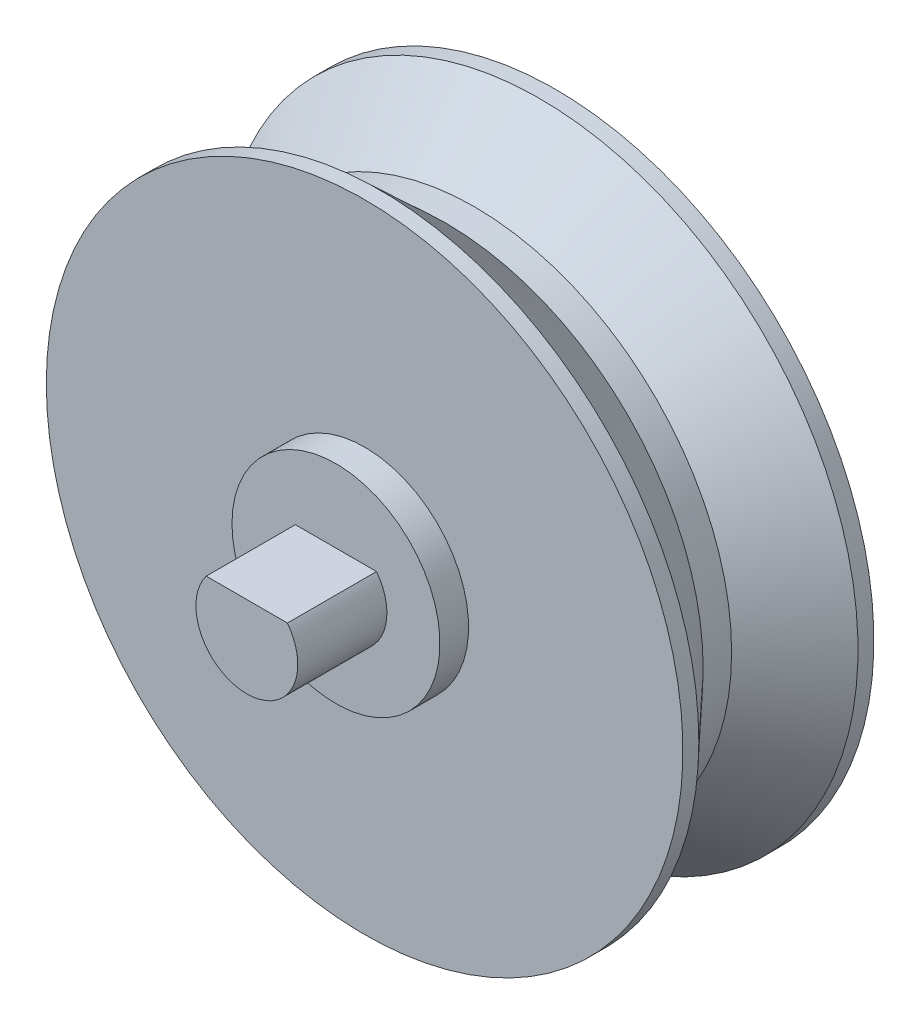
ISO-10303-21;
HEADER;
FILE_DESCRIPTION(('STEP AP214'),'2;1');
FILE_NAME('part.step','',(''),(''),'','','');
FILE_SCHEMA(('AUTOMOTIVE_DESIGN { 1 0 10303 214 1 1 1 1 }'));
ENDSEC;
DATA;
#1=APPLICATION_CONTEXT('core data for automotive mechanical design processes');
#2=APPLICATION_PROTOCOL_DEFINITION('international standard','automotive_design',2000,#1);
#3=PRODUCT_CONTEXT('',#1,'mechanical');
#4=PRODUCT('Part','Part','',(#3));
#5=PRODUCT_RELATED_PRODUCT_CATEGORY('part','',(#4));
#6=PRODUCT_DEFINITION_FORMATION('','',#4);
#7=PRODUCT_DEFINITION_CONTEXT('part definition',#1,'design');
#8=PRODUCT_DEFINITION('design','',#6,#7);
#9=PRODUCT_DEFINITION_SHAPE('','',#8);
#10=(LENGTH_UNIT() NAMED_UNIT(*) SI_UNIT(.MILLI.,.METRE.));
#11=(NAMED_UNIT(*) PLANE_ANGLE_UNIT() SI_UNIT($,.RADIAN.));
#12=(NAMED_UNIT(*) SI_UNIT($,.STERADIAN.) SOLID_ANGLE_UNIT());
#13=UNCERTAINTY_MEASURE_WITH_UNIT(LENGTH_MEASURE(1.E-05),#10,'distance_accuracy_value','');
#14=(GEOMETRIC_REPRESENTATION_CONTEXT(3) GLOBAL_UNCERTAINTY_ASSIGNED_CONTEXT((#13)) GLOBAL_UNIT_ASSIGNED_CONTEXT((#10,
#11,#12)) REPRESENTATION_CONTEXT('',''));
#15=CARTESIAN_POINT('',(0.,0.,0.));
#16=DIRECTION('',(0.,0.,1.));
#17=DIRECTION('',(1.,0.,0.));
#18=AXIS2_PLACEMENT_3D('',#15,#16,#17);
#19=CARTESIAN_POINT('',(0.,0.,28.9));
#20=DIRECTION('',(0.,0.,-1.));
#21=DIRECTION('',(-1.,0.,0.));
#22=AXIS2_PLACEMENT_3D('',#19,#20,#21);
#23=CYLINDRICAL_SURFACE('',#22,30.);
#24=CARTESIAN_POINT('',(0.,0.,27.4));
#25=DIRECTION('',(0.,0.,-1.));
#26=DIRECTION('',(-1.,0.,0.));
#27=AXIS2_PLACEMENT_3D('',#24,#25,#26);
#28=CIRCLE('',#27,30.);
#29=CARTESIAN_POINT('',(-30.,0.,27.4));
#30=VERTEX_POINT('',#29);
#31=EDGE_CURVE('E205',#30,#30,#28,.T.);
#32=ORIENTED_EDGE('',*,*,#31,.F.);
#33=EDGE_LOOP('',(#32));
#34=FACE_BOUND('',#33,.T.);
#35=CARTESIAN_POINT('',(0.,0.,28.9));
#36=DIRECTION('',(0.,0.,-1.));
#37=DIRECTION('',(-1.,0.,0.));
#38=AXIS2_PLACEMENT_3D('',#35,#36,#37);
#39=CIRCLE('',#38,30.);
#40=CARTESIAN_POINT('',(-30.,0.,28.9));
#41=VERTEX_POINT('',#40);
#42=EDGE_CURVE('E129',#41,#41,#39,.T.);
#43=ORIENTED_EDGE('',*,*,#42,.T.);
#44=EDGE_LOOP('',(#43));
#45=FACE_BOUND('',#44,.T.);
#46=ADVANCED_FACE('F49',(#34,#45),#23,.T.);
#47=CARTESIAN_POINT('',(0.,0.,31.6));
#48=DIRECTION('',(0.,0.,-1.));
#49=DIRECTION('',(-1.,0.,0.));
#50=AXIS2_PLACEMENT_3D('',#47,#48,#49);
#51=CYLINDRICAL_SURFACE('',#50,9.8);
#52=CARTESIAN_POINT('',(0.,0.,31.6));
#53=DIRECTION('',(0.,0.,-1.));
#54=DIRECTION('',(-1.,0.,0.));
#55=AXIS2_PLACEMENT_3D('',#52,#53,#54);
#56=CIRCLE('',#55,9.8);
#57=CARTESIAN_POINT('',(-9.8,0.,31.6));
#58=VERTEX_POINT('',#57);
#59=EDGE_CURVE('E105',#58,#58,#56,.T.);
#60=ORIENTED_EDGE('',*,*,#59,.T.);
#61=EDGE_LOOP('',(#60));
#62=FACE_BOUND('',#61,.T.);
#63=CARTESIAN_POINT('',(0.,0.,28.9));
#64=DIRECTION('',(0.,0.,-1.));
#65=DIRECTION('',(-1.,0.,0.));
#66=AXIS2_PLACEMENT_3D('',#63,#64,#65);
#67=CIRCLE('',#66,9.8);
#68=CARTESIAN_POINT('',(-9.8,0.,28.9));
#69=VERTEX_POINT('',#68);
#70=EDGE_CURVE('E125',#69,#69,#67,.F.);
#71=ORIENTED_EDGE('',*,*,#70,.T.);
#72=EDGE_LOOP('',(#71));
#73=FACE_BOUND('',#72,.T.);
#74=ADVANCED_FACE('F173',(#62,#73),#51,.T.);
#75=CARTESIAN_POINT('',(0.,2.9,40.));
#76=DIRECTION('',(0.,1.,0.));
#77=DIRECTION('',(0.,0.,1.));
#78=AXIS2_PLACEMENT_3D('',#75,#76,#77);
#79=PLANE('',#78);
#80=DIRECTION('',(0.,0.,-1.));
#81=VECTOR('',#80,1.);
#82=CARTESIAN_POINT('',(3.82491829978105,2.9,40.));
#83=LINE('',#82,#81);
#84=CARTESIAN_POINT('',(3.82491829978105,2.9,40.));
#85=VERTEX_POINT('',#84);
#86=CARTESIAN_POINT('',(3.82491829978105,2.9,31.6));
#87=VERTEX_POINT('',#86);
#88=EDGE_CURVE('E112',#85,#87,#83,.T.);
#89=ORIENTED_EDGE('',*,*,#88,.T.);
#90=DIRECTION('',(-1.,0.,0.));
#91=VECTOR('',#90,1.);
#92=CARTESIAN_POINT('',(0.,2.9,31.6));
#93=LINE('',#92,#91);
#94=CARTESIAN_POINT('',(-3.82491829978105,2.9,31.6));
#95=VERTEX_POINT('',#94);
#96=EDGE_CURVE('E104',#87,#95,#93,.T.);
#97=ORIENTED_EDGE('',*,*,#96,.T.);
#98=DIRECTION('',(0.,0.,-1.));
#99=VECTOR('',#98,1.);
#100=CARTESIAN_POINT('',(-3.82491829978105,2.9,40.));
#101=LINE('',#100,#99);
#102=CARTESIAN_POINT('',(-3.82491829978105,2.9,40.));
#103=VERTEX_POINT('',#102);
#104=EDGE_CURVE('E96',#103,#95,#101,.T.);
#105=ORIENTED_EDGE('',*,*,#104,.F.);
#106=DIRECTION('',(1.,0.,0.));
#107=VECTOR('',#106,1.);
#108=CARTESIAN_POINT('',(0.,2.9,40.));
#109=LINE('',#108,#107);
#110=EDGE_CURVE('E117',#103,#85,#109,.T.);
#111=ORIENTED_EDGE('',*,*,#110,.T.);
#112=EDGE_LOOP('',(#89,#97,#105,#111));
#113=FACE_BOUND('',#112,.T.);
#114=ADVANCED_FACE('F167',(#113),#79,.T.);
#115=CARTESIAN_POINT('',(0.,0.,40.));
#116=DIRECTION('',(0.,0.,-1.));
#117=DIRECTION('',(-1.,0.,0.));
#118=AXIS2_PLACEMENT_3D('',#115,#116,#117);
#119=CYLINDRICAL_SURFACE('',#118,4.8);
#120=CARTESIAN_POINT('',(0.,0.,31.6));
#121=DIRECTION('',(0.,0.,-1.));
#122=DIRECTION('',(-1.,0.,0.));
#123=AXIS2_PLACEMENT_3D('',#120,#121,#122);
#124=CIRCLE('',#123,4.8);
#125=EDGE_CURVE('E59',#87,#95,#124,.T.);
#126=ORIENTED_EDGE('',*,*,#125,.F.);
#127=ORIENTED_EDGE('',*,*,#88,.F.);
#128=CARTESIAN_POINT('',(0.,0.,40.));
#129=DIRECTION('',(0.,0.,1.));
#130=DIRECTION('',(1.,0.,0.));
#131=AXIS2_PLACEMENT_3D('',#128,#129,#130);
#132=CIRCLE('',#131,4.8);
#133=EDGE_CURVE('E113',#103,#85,#132,.T.);
#134=ORIENTED_EDGE('',*,*,#133,.F.);
#135=ORIENTED_EDGE('',*,*,#104,.T.);
#136=EDGE_LOOP('',(#126,#127,#134,#135));
#137=FACE_BOUND('',#136,.T.);
#138=ADVANCED_FACE('F237',(#137),#119,.T.);
#139=CARTESIAN_POINT('',(0.,0.,40.));
#140=DIRECTION('',(0.,0.,1.));
#141=DIRECTION('',(1.,0.,0.));
#142=AXIS2_PLACEMENT_3D('',#139,#140,#141);
#143=PLANE('',#142);
#144=ORIENTED_EDGE('',*,*,#110,.F.);
#145=ORIENTED_EDGE('',*,*,#133,.T.);
#146=EDGE_LOOP('',(#144,#145));
#147=FACE_BOUND('',#146,.T.);
#148=ADVANCED_FACE('F231',(#147),#143,.T.);
#149=CARTESIAN_POINT('',(0.,0.,31.6));
#150=DIRECTION('',(0.,0.,-1.));
#151=DIRECTION('',(-1.,0.,0.));
#152=AXIS2_PLACEMENT_3D('',#149,#150,#151);
#153=PLANE('',#152);
#154=ORIENTED_EDGE('',*,*,#59,.F.);
#155=EDGE_LOOP('',(#154));
#156=FACE_BOUND('',#155,.T.);
#157=ORIENTED_EDGE('',*,*,#96,.F.);
#158=ORIENTED_EDGE('',*,*,#125,.T.);
#159=EDGE_LOOP('',(#157,#158));
#160=FACE_BOUND('',#159,.T.);
#161=ADVANCED_FACE('F226',(#156,#160),#153,.F.);
#162=CARTESIAN_POINT('',(0.,0.,28.9));
#163=DIRECTION('',(0.,0.,-1.));
#164=DIRECTION('',(-1.,0.,0.));
#165=AXIS2_PLACEMENT_3D('',#162,#163,#164);
#166=PLANE('',#165);
#167=ORIENTED_EDGE('',*,*,#70,.F.);
#168=EDGE_LOOP('',(#167));
#169=FACE_BOUND('',#168,.T.);
#170=ORIENTED_EDGE('',*,*,#42,.F.);
#171=EDGE_LOOP('',(#170));
#172=FACE_BOUND('',#171,.T.);
#173=ADVANCED_FACE('F221',(#169,#172),#166,.F.);
#174=CARTESIAN_POINT('',(0.,0.,27.4));
#175=DIRECTION('',(0.,0.,1.));
#176=DIRECTION('',(1.,0.,0.));
#177=AXIS2_PLACEMENT_3D('',#174,#175,#176);
#178=CONICAL_SURFACE('',#177,30.,0.75092906239794);
#179=CARTESIAN_POINT('',(0.,0.,21.2392857142857));
#180=DIRECTION('',(0.,0.,1.));
#181=DIRECTION('',(1.,0.,0.));
#182=AXIS2_PLACEMENT_3D('',#179,#180,#181);
#183=CIRCLE('',#182,24.25);
#184=CARTESIAN_POINT('',(24.25,0.,21.2392857142857));
#185=VERTEX_POINT('',#184);
#186=EDGE_CURVE('E208',#185,#185,#183,.T.);
#187=ORIENTED_EDGE('',*,*,#186,.T.);
#188=EDGE_LOOP('',(#187));
#189=FACE_BOUND('',#188,.T.);
#190=ORIENTED_EDGE('',*,*,#31,.T.);
#191=EDGE_LOOP('',(#190));
#192=FACE_BOUND('',#191,.T.);
#193=ADVANCED_FACE('F168',(#189,#192),#178,.T.);
#194=CARTESIAN_POINT('',(0.,0.,21.9));
#195=DIRECTION('',(0.,0.,-1.));
#196=DIRECTION('',(-1.,0.,0.));
#197=AXIS2_PLACEMENT_3D('',#194,#195,#196);
#198=CYLINDRICAL_SURFACE('',#197,24.25);
#199=CARTESIAN_POINT('',(0.,0.,18.5607142857143));
#200=DIRECTION('',(0.,0.,-1.));
#201=DIRECTION('',(-1.,0.,0.));
#202=AXIS2_PLACEMENT_3D('',#199,#200,#201);
#203=CIRCLE('',#202,24.25);
#204=CARTESIAN_POINT('',(-24.25,0.,18.5607142857143));
#205=VERTEX_POINT('',#204);
#206=EDGE_CURVE('E53',#205,#205,#203,.T.);
#207=ORIENTED_EDGE('',*,*,#206,.F.);
#208=EDGE_LOOP('',(#207));
#209=FACE_BOUND('',#208,.T.);
#210=ORIENTED_EDGE('',*,*,#186,.F.);
#211=EDGE_LOOP('',(#210));
#212=FACE_BOUND('',#211,.T.);
#213=ADVANCED_FACE('F161',(#209,#212),#198,.T.);
#214=CARTESIAN_POINT('',(0.,0.,0.));
#215=DIRECTION('',(0.,0.,1.));
#216=DIRECTION('',(1.,0.,0.));
#217=AXIS2_PLACEMENT_3D('',#214,#215,#216);
#218=PLANE('',#217);
#219=DIRECTION('',(1.,0.,0.));
#220=VECTOR('',#219,1.);
#221=CARTESIAN_POINT('',(0.,2.9,0.));
#222=LINE('',#221,#220);
#223=CARTESIAN_POINT('',(-3.82491829978105,2.9,0.));
#224=VERTEX_POINT('',#223);
#225=CARTESIAN_POINT('',(3.82491829978105,2.9,0.));
#226=VERTEX_POINT('',#225);
#227=EDGE_CURVE('E153',#224,#226,#222,.T.);
#228=ORIENTED_EDGE('',*,*,#227,.T.);
#229=CARTESIAN_POINT('',(0.,0.,0.));
#230=DIRECTION('',(0.,0.,1.));
#231=DIRECTION('',(1.,0.,0.));
#232=AXIS2_PLACEMENT_3D('',#229,#230,#231);
#233=CIRCLE('',#232,4.8);
#234=EDGE_CURVE('E109',#224,#226,#233,.T.);
#235=ORIENTED_EDGE('',*,*,#234,.F.);
#236=EDGE_LOOP('',(#228,#235));
#237=FACE_BOUND('',#236,.T.);
#238=ADVANCED_FACE('F159',(#237),#218,.F.);
#239=DIRECTION('',(-1.,0.,0.));
#240=VECTOR('',#239,1.);
#241=CARTESIAN_POINT('',(0.,2.9,8.2));
#242=LINE('',#241,#240);
#243=CARTESIAN_POINT('',(3.82491829978105,2.9,8.2));
#244=VERTEX_POINT('',#243);
#245=CARTESIAN_POINT('',(-3.82491829978105,2.9,8.2));
#246=VERTEX_POINT('',#245);
#247=EDGE_CURVE('E66',#244,#246,#242,.T.);
#248=ORIENTED_EDGE('',*,*,#247,.F.);
#249=EDGE_CURVE('E100',#244,#226,#83,.T.);
#250=ORIENTED_EDGE('',*,*,#249,.T.);
#251=ORIENTED_EDGE('',*,*,#227,.F.);
#252=EDGE_CURVE('E102',#246,#224,#101,.T.);
#253=ORIENTED_EDGE('',*,*,#252,.F.);
#254=EDGE_LOOP('',(#248,#250,#251,#253));
#255=FACE_BOUND('',#254,.T.);
#256=ADVANCED_FACE('F51',(#255),#79,.T.);
#257=ORIENTED_EDGE('',*,*,#249,.F.);
#258=CARTESIAN_POINT('',(0.,0.,8.2));
#259=DIRECTION('',(0.,0.,-1.));
#260=DIRECTION('',(-1.,0.,0.));
#261=AXIS2_PLACEMENT_3D('',#258,#259,#260);
#262=CIRCLE('',#261,4.8);
#263=EDGE_CURVE('E90',#244,#246,#262,.T.);
#264=ORIENTED_EDGE('',*,*,#263,.T.);
#265=ORIENTED_EDGE('',*,*,#252,.T.);
#266=ORIENTED_EDGE('',*,*,#234,.T.);
#267=EDGE_LOOP('',(#257,#264,#265,#266));
#268=FACE_BOUND('',#267,.T.);
#269=ADVANCED_FACE('F107',(#268),#119,.T.);
#270=CARTESIAN_POINT('',(0.,0.,8.2));
#271=DIRECTION('',(0.,0.,-1.));
#272=DIRECTION('',(-1.,0.,0.));
#273=AXIS2_PLACEMENT_3D('',#270,#271,#272);
#274=PLANE('',#273);
#275=CARTESIAN_POINT('',(0.,0.,8.2));
#276=DIRECTION('',(0.,0.,-1.));
#277=DIRECTION('',(-1.,0.,0.));
#278=AXIS2_PLACEMENT_3D('',#275,#276,#277);
#279=CIRCLE('',#278,9.8);
#280=CARTESIAN_POINT('',(-9.8,0.,8.2));
#281=VERTEX_POINT('',#280);
#282=EDGE_CURVE('E128',#281,#281,#279,.T.);
#283=ORIENTED_EDGE('',*,*,#282,.T.);
#284=EDGE_LOOP('',(#283));
#285=FACE_BOUND('',#284,.T.);
#286=ORIENTED_EDGE('',*,*,#263,.F.);
#287=ORIENTED_EDGE('',*,*,#247,.T.);
#288=EDGE_LOOP('',(#286,#287));
#289=FACE_BOUND('',#288,.T.);
#290=ADVANCED_FACE('F91',(#285,#289),#274,.T.);
#291=CARTESIAN_POINT('',(0.,0.,10.9));
#292=DIRECTION('',(0.,0.,-1.));
#293=DIRECTION('',(-1.,0.,0.));
#294=AXIS2_PLACEMENT_3D('',#291,#292,#293);
#295=CIRCLE('',#294,9.8);
#296=CARTESIAN_POINT('',(-9.8,0.,10.9));
#297=VERTEX_POINT('',#296);
#298=EDGE_CURVE('E11',#297,#297,#295,.F.);
#299=ORIENTED_EDGE('',*,*,#298,.F.);
#300=EDGE_LOOP('',(#299));
#301=FACE_BOUND('',#300,.T.);
#302=ORIENTED_EDGE('',*,*,#282,.F.);
#303=EDGE_LOOP('',(#302));
#304=FACE_BOUND('',#303,.T.);
#305=ADVANCED_FACE('F182',(#301,#304),#51,.T.);
#306=CARTESIAN_POINT('',(0.,0.,10.9));
#307=DIRECTION('',(0.,0.,-1.));
#308=DIRECTION('',(-1.,0.,0.));
#309=AXIS2_PLACEMENT_3D('',#306,#307,#308);
#310=PLANE('',#309);
#311=ORIENTED_EDGE('',*,*,#298,.T.);
#312=EDGE_LOOP('',(#311));
#313=FACE_BOUND('',#312,.T.);
#314=CARTESIAN_POINT('',(0.,0.,10.9));
#315=DIRECTION('',(0.,0.,-1.));
#316=DIRECTION('',(-1.,0.,0.));
#317=AXIS2_PLACEMENT_3D('',#314,#315,#316);
#318=CIRCLE('',#317,30.);
#319=CARTESIAN_POINT('',(-30.,0.,10.9));
#320=VERTEX_POINT('',#319);
#321=EDGE_CURVE('E137',#320,#320,#318,.T.);
#322=ORIENTED_EDGE('',*,*,#321,.T.);
#323=EDGE_LOOP('',(#322));
#324=FACE_BOUND('',#323,.T.);
#325=ADVANCED_FACE('F188',(#313,#324),#310,.T.);
#326=CARTESIAN_POINT('',(0.,0.,12.4));
#327=DIRECTION('',(0.,0.,-1.));
#328=DIRECTION('',(-1.,0.,0.));
#329=AXIS2_PLACEMENT_3D('',#326,#327,#328);
#330=CIRCLE('',#329,30.);
#331=CARTESIAN_POINT('',(-30.,0.,12.4));
#332=VERTEX_POINT('',#331);
#333=EDGE_CURVE('E143',#332,#332,#330,.T.);
#334=ORIENTED_EDGE('',*,*,#333,.T.);
#335=EDGE_LOOP('',(#334));
#336=FACE_BOUND('',#335,.T.);
#337=ORIENTED_EDGE('',*,*,#321,.F.);
#338=EDGE_LOOP('',(#337));
#339=FACE_BOUND('',#338,.T.);
#340=ADVANCED_FACE('F176',(#336,#339),#23,.T.);
#341=CARTESIAN_POINT('',(0.,0.,19.9));
#342=DIRECTION('',(0.,0.,-1.));
#343=DIRECTION('',(-1.,0.,0.));
#344=AXIS2_PLACEMENT_3D('',#341,#342,#343);
#345=CONICAL_SURFACE('',#344,23.,0.75092906239794);
#346=ORIENTED_EDGE('',*,*,#206,.T.);
#347=EDGE_LOOP('',(#346));
#348=FACE_BOUND('',#347,.T.);
#349=ORIENTED_EDGE('',*,*,#333,.F.);
#350=EDGE_LOOP('',(#349));
#351=FACE_BOUND('',#350,.T.);
#352=ADVANCED_FACE('F187',(#348,#351),#345,.T.);
#353=CLOSED_SHELL('',(#46,#74,#114,#138,#148,#161,#173,#193,#213,#238,#256,#269,#290,#305,#325,
#340,#352));
#354=MANIFOLD_SOLID_BREP('B2',#353);
#355=ADVANCED_BREP_SHAPE_REPRESENTATION('',(#18,#354),#14);
#356=SHAPE_DEFINITION_REPRESENTATION(#9,#355);
ENDSEC;
END-ISO-10303-21;
